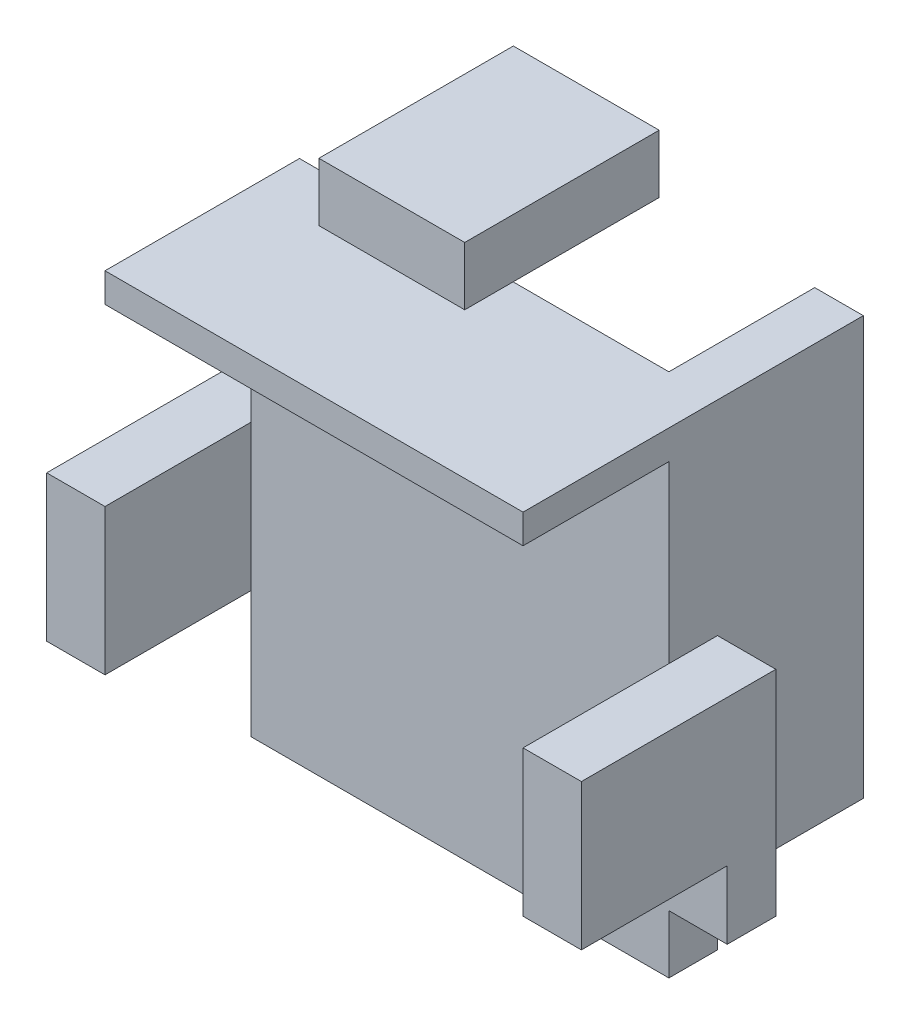
ISO-10303-21;
HEADER;
FILE_DESCRIPTION(('STEP AP214'),'2;1');
FILE_NAME('part.step','',(''),(''),'','','');
FILE_SCHEMA(('AUTOMOTIVE_DESIGN { 1 0 10303 214 1 1 1 1 }'));
ENDSEC;
DATA;
#1=APPLICATION_CONTEXT('core data for automotive mechanical design processes');
#2=APPLICATION_PROTOCOL_DEFINITION('international standard','automotive_design',2000,#1);
#3=PRODUCT_CONTEXT('',#1,'mechanical');
#4=PRODUCT('Part','Part','',(#3));
#5=PRODUCT_RELATED_PRODUCT_CATEGORY('part','',(#4));
#6=PRODUCT_DEFINITION_FORMATION('','',#4);
#7=PRODUCT_DEFINITION_CONTEXT('part definition',#1,'design');
#8=PRODUCT_DEFINITION('design','',#6,#7);
#9=PRODUCT_DEFINITION_SHAPE('','',#8);
#10=(LENGTH_UNIT() NAMED_UNIT(*) SI_UNIT(.MILLI.,.METRE.));
#11=(NAMED_UNIT(*) PLANE_ANGLE_UNIT() SI_UNIT($,.RADIAN.));
#12=(NAMED_UNIT(*) SI_UNIT($,.STERADIAN.) SOLID_ANGLE_UNIT());
#13=UNCERTAINTY_MEASURE_WITH_UNIT(LENGTH_MEASURE(1.E-05),#10,'distance_accuracy_value','');
#14=(GEOMETRIC_REPRESENTATION_CONTEXT(3) GLOBAL_UNCERTAINTY_ASSIGNED_CONTEXT((#13)) GLOBAL_UNIT_ASSIGNED_CONTEXT((#10,
#11,#12)) REPRESENTATION_CONTEXT('',''));
#15=CARTESIAN_POINT('',(0.,0.,0.));
#16=DIRECTION('',(0.,0.,1.));
#17=DIRECTION('',(1.,0.,0.));
#18=AXIS2_PLACEMENT_3D('',#15,#16,#17);
#19=CARTESIAN_POINT('',(-64.7969593030904,52.0531902447985,-20.));
#20=DIRECTION('',(-1.,0.,0.));
#21=DIRECTION('',(0.,0.,1.));
#22=AXIS2_PLACEMENT_3D('',#19,#20,#21);
#23=PLANE('',#22);
#24=DIRECTION('',(0.,-1.,0.));
#25=VECTOR('',#24,1.);
#26=CARTESIAN_POINT('',(-64.7969593030904,52.0531902447985,0.));
#27=LINE('',#26,#25);
#28=CARTESIAN_POINT('',(-64.7969593030904,58.0531902447985,0.));
#29=VERTEX_POINT('',#28);
#30=CARTESIAN_POINT('',(-64.7969593030904,52.0531902447985,0.));
#31=VERTEX_POINT('',#30);
#32=EDGE_CURVE('E110',#29,#31,#27,.T.);
#33=ORIENTED_EDGE('',*,*,#32,.F.);
#34=DIRECTION('',(0.,0.,1.));
#35=VECTOR('',#34,1.);
#36=CARTESIAN_POINT('',(-64.7969593030904,58.0531902447985,-20.));
#37=LINE('',#36,#35);
#38=CARTESIAN_POINT('',(-64.7969593030904,58.0531902447985,-20.));
#39=VERTEX_POINT('',#38);
#40=EDGE_CURVE('E12',#39,#29,#37,.T.);
#41=ORIENTED_EDGE('',*,*,#40,.F.);
#42=DIRECTION('',(0.,-1.,0.));
#43=VECTOR('',#42,1.);
#44=CARTESIAN_POINT('',(-64.7969593030904,52.0531902447985,-20.));
#45=LINE('',#44,#43);
#46=CARTESIAN_POINT('',(-64.7969593030904,52.0531902447985,-20.));
#47=VERTEX_POINT('',#46);
#48=EDGE_CURVE('E104',#39,#47,#45,.T.);
#49=ORIENTED_EDGE('',*,*,#48,.T.);
#50=DIRECTION('',(0.,0.,1.));
#51=VECTOR('',#50,1.);
#52=CARTESIAN_POINT('',(-64.7969593030904,52.0531902447985,-20.));
#53=LINE('',#52,#51);
#54=EDGE_CURVE('E49',#47,#31,#53,.T.);
#55=ORIENTED_EDGE('',*,*,#54,.T.);
#56=EDGE_LOOP('',(#33,#41,#49,#55));
#57=FACE_BOUND('',#56,.T.);
#58=ADVANCED_FACE('F46',(#57),#23,.T.);
#59=CARTESIAN_POINT('',(-64.7969593030904,58.0531902447985,-20.));
#60=DIRECTION('',(0.,1.,0.));
#61=DIRECTION('',(0.,0.,1.));
#62=AXIS2_PLACEMENT_3D('',#59,#60,#61);
#63=PLANE('',#62);
#64=DIRECTION('',(-1.,0.,0.));
#65=VECTOR('',#64,1.);
#66=CARTESIAN_POINT('',(-64.7969593030904,58.0531902447985,0.));
#67=LINE('',#66,#65);
#68=CARTESIAN_POINT('',(-49.7969593030904,58.0531902447985,0.));
#69=VERTEX_POINT('',#68);
#70=EDGE_CURVE('E106',#69,#29,#67,.T.);
#71=ORIENTED_EDGE('',*,*,#70,.F.);
#72=DIRECTION('',(0.,0.,1.));
#73=VECTOR('',#72,1.);
#74=CARTESIAN_POINT('',(-49.7969593030904,58.0531902447985,-20.));
#75=LINE('',#74,#73);
#76=CARTESIAN_POINT('',(-49.7969593030904,58.0531902447985,-20.));
#77=VERTEX_POINT('',#76);
#78=EDGE_CURVE('E55',#77,#69,#75,.T.);
#79=ORIENTED_EDGE('',*,*,#78,.F.);
#80=DIRECTION('',(-1.,0.,0.));
#81=VECTOR('',#80,1.);
#82=CARTESIAN_POINT('',(-64.7969593030904,58.0531902447985,-20.));
#83=LINE('',#82,#81);
#84=EDGE_CURVE('E101',#77,#39,#83,.T.);
#85=ORIENTED_EDGE('',*,*,#84,.T.);
#86=ORIENTED_EDGE('',*,*,#40,.T.);
#87=EDGE_LOOP('',(#71,#79,#85,#86));
#88=FACE_BOUND('',#87,.T.);
#89=ADVANCED_FACE('F120',(#88),#63,.T.);
#90=CARTESIAN_POINT('',(-49.7969593030904,52.0531902447985,-20.));
#91=DIRECTION('',(1.,0.,0.));
#92=DIRECTION('',(0.,0.,-1.));
#93=AXIS2_PLACEMENT_3D('',#90,#91,#92);
#94=PLANE('',#93);
#95=DIRECTION('',(0.,1.,0.));
#96=VECTOR('',#95,1.);
#97=CARTESIAN_POINT('',(-49.7969593030904,52.0531902447985,0.));
#98=LINE('',#97,#96);
#99=CARTESIAN_POINT('',(-49.7969593030904,52.0531902447985,0.));
#100=VERTEX_POINT('',#99);
#101=EDGE_CURVE('E96',#100,#69,#98,.T.);
#102=ORIENTED_EDGE('',*,*,#101,.F.);
#103=DIRECTION('',(0.,0.,1.));
#104=VECTOR('',#103,1.);
#105=CARTESIAN_POINT('',(-49.7969593030904,52.0531902447985,-20.));
#106=LINE('',#105,#104);
#107=CARTESIAN_POINT('',(-49.7969593030904,52.0531902447985,-20.));
#108=VERTEX_POINT('',#107);
#109=EDGE_CURVE('E91',#108,#100,#106,.T.);
#110=ORIENTED_EDGE('',*,*,#109,.F.);
#111=DIRECTION('',(0.,1.,0.));
#112=VECTOR('',#111,1.);
#113=CARTESIAN_POINT('',(-49.7969593030904,52.0531902447985,-20.));
#114=LINE('',#113,#112);
#115=EDGE_CURVE('E94',#108,#77,#114,.T.);
#116=ORIENTED_EDGE('',*,*,#115,.T.);
#117=ORIENTED_EDGE('',*,*,#78,.T.);
#118=EDGE_LOOP('',(#102,#110,#116,#117));
#119=FACE_BOUND('',#118,.T.);
#120=ADVANCED_FACE('F93',(#119),#94,.T.);
#121=CARTESIAN_POINT('',(-64.7969593030904,52.0531902447985,-20.));
#122=DIRECTION('',(0.,-1.,0.));
#123=DIRECTION('',(0.,0.,-1.));
#124=AXIS2_PLACEMENT_3D('',#121,#122,#123);
#125=PLANE('',#124);
#126=DIRECTION('',(1.,0.,0.));
#127=VECTOR('',#126,1.);
#128=CARTESIAN_POINT('',(-64.7969593030904,52.0531902447985,0.));
#129=LINE('',#128,#127);
#130=EDGE_CURVE('E113',#31,#100,#129,.T.);
#131=ORIENTED_EDGE('',*,*,#130,.F.);
#132=ORIENTED_EDGE('',*,*,#54,.F.);
#133=DIRECTION('',(1.,0.,0.));
#134=VECTOR('',#133,1.);
#135=CARTESIAN_POINT('',(-64.7969593030904,52.0531902447985,-20.));
#136=LINE('',#135,#134);
#137=EDGE_CURVE('E100',#47,#108,#136,.T.);
#138=ORIENTED_EDGE('',*,*,#137,.T.);
#139=ORIENTED_EDGE('',*,*,#109,.T.);
#140=EDGE_LOOP('',(#131,#132,#138,#139));
#141=FACE_BOUND('',#140,.T.);
#142=ADVANCED_FACE('F103',(#141),#125,.T.);
#143=CARTESIAN_POINT('',(0.,0.,-20.));
#144=DIRECTION('',(0.,0.,-1.));
#145=DIRECTION('',(-1.,0.,0.));
#146=AXIS2_PLACEMENT_3D('',#143,#144,#145);
#147=PLANE('',#146);
#148=ORIENTED_EDGE('',*,*,#48,.F.);
#149=ORIENTED_EDGE('',*,*,#84,.F.);
#150=ORIENTED_EDGE('',*,*,#115,.F.);
#151=ORIENTED_EDGE('',*,*,#137,.F.);
#152=EDGE_LOOP('',(#148,#149,#150,#151));
#153=FACE_BOUND('',#152,.T.);
#154=ADVANCED_FACE('F99',(#153),#147,.T.);
#155=CARTESIAN_POINT('',(0.,0.,0.));
#156=DIRECTION('',(0.,0.,-1.));
#157=DIRECTION('',(-1.,0.,0.));
#158=AXIS2_PLACEMENT_3D('',#155,#156,#157);
#159=PLANE('',#158);
#160=ORIENTED_EDGE('',*,*,#32,.T.);
#161=ORIENTED_EDGE('',*,*,#130,.T.);
#162=ORIENTED_EDGE('',*,*,#101,.T.);
#163=ORIENTED_EDGE('',*,*,#70,.T.);
#164=EDGE_LOOP('',(#160,#161,#162,#163));
#165=FACE_BOUND('',#164,.T.);
#166=ADVANCED_FACE('F119',(#165),#159,.F.);
#167=CLOSED_SHELL('',(#58,#89,#120,#142,#154,#166));
#168=MANIFOLD_SOLID_BREP('B2',#167);
#169=CARTESIAN_POINT('',(0.,0.,-5.));
#170=DIRECTION('',(0.,0.,1.));
#171=DIRECTION('',(1.,0.,0.));
#172=AXIS2_PLACEMENT_3D('',#169,#170,#171);
#173=PLANE('',#172);
#174=DIRECTION('',(0.,-1.,0.));
#175=VECTOR('',#174,1.);
#176=CARTESIAN_POINT('',(-28.7969593030904,52.032605761782,-5.));
#177=LINE('',#176,#175);
#178=CARTESIAN_POINT('',(-28.7969593030904,31.032605761782,-5.));
#179=VERTEX_POINT('',#178);
#180=CARTESIAN_POINT('',(-28.7969593030904,9.03260576178203,-5.));
#181=VERTEX_POINT('',#180);
#182=EDGE_CURVE('E352',#179,#181,#177,.T.);
#183=ORIENTED_EDGE('',*,*,#182,.F.);
#184=DIRECTION('',(1.,0.,0.));
#185=VECTOR('',#184,1.);
#186=CARTESIAN_POINT('',(0.,31.032605761782,-5.));
#187=LINE('',#186,#185);
#188=CARTESIAN_POINT('',(-22.7969593030904,31.032605761782,-5.));
#189=VERTEX_POINT('',#188);
#190=EDGE_CURVE('E443',#179,#189,#187,.T.);
#191=ORIENTED_EDGE('',*,*,#190,.T.);
#192=DIRECTION('',(0.,-1.,0.));
#193=VECTOR('',#192,1.);
#194=CARTESIAN_POINT('',(-22.7969593030904,0.,-5.));
#195=LINE('',#194,#193);
#196=CARTESIAN_POINT('',(-22.7969593030904,9.03260576178203,-5.));
#197=VERTEX_POINT('',#196);
#198=EDGE_CURVE('E446',#189,#197,#195,.T.);
#199=ORIENTED_EDGE('',*,*,#198,.T.);
#200=DIRECTION('',(1.,0.,0.));
#201=VECTOR('',#200,1.);
#202=CARTESIAN_POINT('',(0.,9.03260576178203,-5.));
#203=LINE('',#202,#201);
#204=EDGE_CURVE('E449',#181,#197,#203,.T.);
#205=ORIENTED_EDGE('',*,*,#204,.F.);
#206=EDGE_LOOP('',(#183,#191,#199,#205));
#207=FACE_BOUND('',#206,.T.);
#208=ADVANCED_FACE('F169',(#207),#173,.F.);
#209=DIRECTION('',(-1.,0.,0.));
#210=VECTOR('',#209,1.);
#211=CARTESIAN_POINT('',(-28.7969593030904,9.03260576178203,-5.));
#212=LINE('',#211,#210);
#213=CARTESIAN_POINT('',(-33.7969593030904,9.03260576178203,-5.));
#214=VERTEX_POINT('',#213);
#215=EDGE_CURVE('E562',#181,#214,#212,.T.);
#216=ORIENTED_EDGE('',*,*,#215,.F.);
#217=DIRECTION('',(0.,-1.,0.));
#218=VECTOR('',#217,1.);
#219=CARTESIAN_POINT('',(-28.7969593030904,0.,-5.));
#220=LINE('',#219,#218);
#221=CARTESIAN_POINT('',(-28.7969593030904,3.03260576178203,-5.));
#222=VERTEX_POINT('',#221);
#223=EDGE_CURVE('E448',#181,#222,#220,.T.);
#224=ORIENTED_EDGE('',*,*,#223,.T.);
#225=DIRECTION('',(1.,0.,0.));
#226=VECTOR('',#225,1.);
#227=CARTESIAN_POINT('',(0.,3.03260576178202,-5.));
#228=LINE('',#227,#226);
#229=CARTESIAN_POINT('',(-35.9278686997028,3.03260576178203,-5.));
#230=VERTEX_POINT('',#229);
#231=EDGE_CURVE('E455',#230,#222,#228,.T.);
#232=ORIENTED_EDGE('',*,*,#231,.F.);
#233=DIRECTION('',(0.,-1.,0.));
#234=VECTOR('',#233,1.);
#235=CARTESIAN_POINT('',(-35.9278686997028,9.03260576178203,-5.));
#236=LINE('',#235,#234);
#237=CARTESIAN_POINT('',(-35.9278686997028,9.03260576178203,-5.));
#238=VERTEX_POINT('',#237);
#239=EDGE_CURVE('E510',#238,#230,#236,.T.);
#240=ORIENTED_EDGE('',*,*,#239,.F.);
#241=DIRECTION('',(1.,0.,0.));
#242=VECTOR('',#241,1.);
#243=CARTESIAN_POINT('',(-50.7969593030904,9.03260576178203,-5.));
#244=LINE('',#243,#242);
#245=CARTESIAN_POINT('',(-64.7969593030904,9.03260576178203,-5.));
#246=VERTEX_POINT('',#245);
#247=EDGE_CURVE('E500',#246,#238,#244,.T.);
#248=ORIENTED_EDGE('',*,*,#247,.F.);
#249=DIRECTION('',(0.,-1.,0.));
#250=VECTOR('',#249,1.);
#251=CARTESIAN_POINT('',(-64.7969593030904,9.03260576178203,-5.));
#252=LINE('',#251,#250);
#253=CARTESIAN_POINT('',(-64.7969593030904,3.03260576178203,-5.));
#254=VERTEX_POINT('',#253);
#255=EDGE_CURVE('E372',#246,#254,#252,.T.);
#256=ORIENTED_EDGE('',*,*,#255,.T.);
#257=DIRECTION('',(1.,0.,0.));
#258=VECTOR('',#257,1.);
#259=CARTESIAN_POINT('',(-71.7969593030904,3.03260576178203,-5.));
#260=LINE('',#259,#258);
#261=CARTESIAN_POINT('',(-71.7969593030904,3.03260576178203,-5.));
#262=VERTEX_POINT('',#261);
#263=EDGE_CURVE('E369',#262,#254,#260,.T.);
#264=ORIENTED_EDGE('',*,*,#263,.F.);
#265=DIRECTION('',(0.,-1.,0.));
#266=VECTOR('',#265,1.);
#267=CARTESIAN_POINT('',(-71.7969593030904,9.03260576178203,-5.));
#268=LINE('',#267,#266);
#269=CARTESIAN_POINT('',(-71.7969593030904,16.032605761782,-5.));
#270=VERTEX_POINT('',#269);
#271=EDGE_CURVE('E365',#270,#262,#268,.T.);
#272=ORIENTED_EDGE('',*,*,#271,.F.);
#273=DIRECTION('',(1.,0.,0.));
#274=VECTOR('',#273,1.);
#275=CARTESIAN_POINT('',(0.,16.032605761782,-5.));
#276=LINE('',#275,#274);
#277=CARTESIAN_POINT('',(-77.7969593030904,16.032605761782,-5.));
#278=VERTEX_POINT('',#277);
#279=EDGE_CURVE('E458',#278,#270,#276,.T.);
#280=ORIENTED_EDGE('',*,*,#279,.F.);
#281=DIRECTION('',(0.,-1.,0.));
#282=VECTOR('',#281,1.);
#283=CARTESIAN_POINT('',(-77.7969593030904,0.,-5.));
#284=LINE('',#283,#282);
#285=CARTESIAN_POINT('',(-77.7969593030904,31.032605761782,-5.));
#286=VERTEX_POINT('',#285);
#287=EDGE_CURVE('E463',#286,#278,#284,.T.);
#288=ORIENTED_EDGE('',*,*,#287,.F.);
#289=DIRECTION('',(1.,0.,0.));
#290=VECTOR('',#289,1.);
#291=CARTESIAN_POINT('',(0.,31.032605761782,-5.));
#292=LINE('',#291,#290);
#293=CARTESIAN_POINT('',(-71.7969593030904,31.032605761782,-5.));
#294=VERTEX_POINT('',#293);
#295=EDGE_CURVE('E385',#286,#294,#292,.T.);
#296=ORIENTED_EDGE('',*,*,#295,.T.);
#297=DIRECTION('',(0.,1.,0.));
#298=VECTOR('',#297,1.);
#299=CARTESIAN_POINT('',(-71.7969593030904,0.,-5.));
#300=LINE('',#299,#298);
#301=CARTESIAN_POINT('',(-71.7969593030904,52.032605761782,-5.));
#302=VERTEX_POINT('',#301);
#303=EDGE_CURVE('E454',#294,#302,#300,.T.);
#304=ORIENTED_EDGE('',*,*,#303,.T.);
#305=DIRECTION('',(-1.,0.,0.));
#306=VECTOR('',#305,1.);
#307=CARTESIAN_POINT('',(0.,52.032605761782,-5.));
#308=LINE('',#307,#306);
#309=CARTESIAN_POINT('',(-33.7969593030904,52.032605761782,-5.));
#310=VERTEX_POINT('',#309);
#311=EDGE_CURVE('E191',#310,#302,#308,.T.);
#312=ORIENTED_EDGE('',*,*,#311,.F.);
#313=DIRECTION('',(0.,1.,0.));
#314=VECTOR('',#313,1.);
#315=CARTESIAN_POINT('',(-33.7969593030904,52.032605761782,-5.));
#316=LINE('',#315,#314);
#317=EDGE_CURVE('E186',#214,#310,#316,.T.);
#318=ORIENTED_EDGE('',*,*,#317,.F.);
#319=EDGE_LOOP('',(#216,#224,#232,#240,#248,#256,#264,#272,#280,#288,#296,#304,#312,#318));
#320=FACE_BOUND('',#319,.T.);
#321=ADVANCED_FACE('F535',(#320),#173,.F.);
#322=CARTESIAN_POINT('',(-71.7969593030904,0.,-5.));
#323=DIRECTION('',(1.,0.,0.));
#324=DIRECTION('',(0.,0.,-1.));
#325=AXIS2_PLACEMENT_3D('',#322,#323,#324);
#326=PLANE('',#325);
#327=ORIENTED_EDGE('',*,*,#303,.F.);
#328=DIRECTION('',(0.,0.,1.));
#329=VECTOR('',#328,1.);
#330=CARTESIAN_POINT('',(-71.7969593030904,31.032605761782,-5.));
#331=LINE('',#330,#329);
#332=CARTESIAN_POINT('',(-71.7969593030904,31.032605761782,0.));
#333=VERTEX_POINT('',#332);
#334=EDGE_CURVE('E437',#294,#333,#331,.T.);
#335=ORIENTED_EDGE('',*,*,#334,.T.);
#336=DIRECTION('',(0.,1.,0.));
#337=VECTOR('',#336,1.);
#338=CARTESIAN_POINT('',(-71.7969593030904,0.,0.));
#339=LINE('',#338,#337);
#340=CARTESIAN_POINT('',(-71.7969593030904,49.032605761782,0.));
#341=VERTEX_POINT('',#340);
#342=EDGE_CURVE('E439',#333,#341,#339,.T.);
#343=ORIENTED_EDGE('',*,*,#342,.T.);
#344=DIRECTION('',(0.,0.,-1.));
#345=VECTOR('',#344,1.);
#346=CARTESIAN_POINT('',(-71.7969593030904,49.032605761782,15.));
#347=LINE('',#346,#345);
#348=CARTESIAN_POINT('',(-71.7969593030904,49.032605761782,15.));
#349=VERTEX_POINT('',#348);
#350=EDGE_CURVE('E490',#349,#341,#347,.T.);
#351=ORIENTED_EDGE('',*,*,#350,.F.);
#352=DIRECTION('',(0.,1.,0.));
#353=VECTOR('',#352,1.);
#354=CARTESIAN_POINT('',(-71.7969593030904,0.,15.));
#355=LINE('',#354,#353);
#356=CARTESIAN_POINT('',(-71.7969593030904,52.032605761782,15.));
#357=VERTEX_POINT('',#356);
#358=EDGE_CURVE('E442',#349,#357,#355,.T.);
#359=ORIENTED_EDGE('',*,*,#358,.T.);
#360=DIRECTION('',(0.,0.,1.));
#361=VECTOR('',#360,1.);
#362=CARTESIAN_POINT('',(-71.7969593030904,52.032605761782,-5.));
#363=LINE('',#362,#361);
#364=EDGE_CURVE('E417',#302,#357,#363,.T.);
#365=ORIENTED_EDGE('',*,*,#364,.F.);
#366=EDGE_LOOP('',(#327,#335,#343,#351,#359,#365));
#367=FACE_BOUND('',#366,.T.);
#368=ADVANCED_FACE('F587',(#367),#326,.F.);
#369=CARTESIAN_POINT('',(0.,52.032605761782,-5.));
#370=DIRECTION('',(0.,1.,0.));
#371=DIRECTION('',(0.,0.,1.));
#372=AXIS2_PLACEMENT_3D('',#369,#370,#371);
#373=PLANE('',#372);
#374=DIRECTION('',(0.,0.,-1.));
#375=VECTOR('',#374,1.);
#376=CARTESIAN_POINT('',(-28.7969593030904,52.032605761782,15.));
#377=LINE('',#376,#375);
#378=CARTESIAN_POINT('',(-28.7969593030904,52.032605761782,15.));
#379=VERTEX_POINT('',#378);
#380=CARTESIAN_POINT('',(-28.7969593030904,52.032605761782,-20.));
#381=VERTEX_POINT('',#380);
#382=EDGE_CURVE('E378',#379,#381,#377,.T.);
#383=ORIENTED_EDGE('',*,*,#382,.T.);
#384=DIRECTION('',(1.,0.,0.));
#385=VECTOR('',#384,1.);
#386=CARTESIAN_POINT('',(-28.7969593030904,52.032605761782,-20.));
#387=LINE('',#386,#385);
#388=CARTESIAN_POINT('',(-33.7969593030904,52.032605761782,-20.));
#389=VERTEX_POINT('',#388);
#390=EDGE_CURVE('E345',#389,#381,#387,.T.);
#391=ORIENTED_EDGE('',*,*,#390,.F.);
#392=DIRECTION('',(0.,0.,1.));
#393=VECTOR('',#392,1.);
#394=CARTESIAN_POINT('',(-33.7969593030904,52.032605761782,-20.));
#395=LINE('',#394,#393);
#396=EDGE_CURVE('E358',#389,#310,#395,.T.);
#397=ORIENTED_EDGE('',*,*,#396,.T.);
#398=ORIENTED_EDGE('',*,*,#311,.T.);
#399=ORIENTED_EDGE('',*,*,#364,.T.);
#400=DIRECTION('',(-1.,0.,0.));
#401=VECTOR('',#400,1.);
#402=CARTESIAN_POINT('',(0.,52.032605761782,15.));
#403=LINE('',#402,#401);
#404=EDGE_CURVE('E493',#379,#357,#403,.T.);
#405=ORIENTED_EDGE('',*,*,#404,.F.);
#406=EDGE_LOOP('',(#383,#391,#397,#398,#399,#405));
#407=FACE_BOUND('',#406,.T.);
#408=ADVANCED_FACE('F573',(#407),#373,.T.);
#409=CARTESIAN_POINT('',(-28.7969593030904,16.032605761782,15.));
#410=DIRECTION('',(0.,1.,0.));
#411=DIRECTION('',(0.,0.,1.));
#412=AXIS2_PLACEMENT_3D('',#409,#410,#411);
#413=PLANE('',#412);
#414=DIRECTION('',(1.,0.,0.));
#415=VECTOR('',#414,1.);
#416=CARTESIAN_POINT('',(-28.7969593030904,16.032605761782,0.));
#417=LINE('',#416,#415);
#418=CARTESIAN_POINT('',(-28.7969593030904,16.032605761782,0.));
#419=VERTEX_POINT('',#418);
#420=CARTESIAN_POINT('',(-22.7969593030904,16.032605761782,0.));
#421=VERTEX_POINT('',#420);
#422=EDGE_CURVE('E381',#419,#421,#417,.T.);
#423=ORIENTED_EDGE('',*,*,#422,.T.);
#424=DIRECTION('',(0.,0.,-1.));
#425=VECTOR('',#424,1.);
#426=CARTESIAN_POINT('',(-22.7969593030904,16.032605761782,15.));
#427=LINE('',#426,#425);
#428=CARTESIAN_POINT('',(-22.7969593030904,16.032605761782,15.));
#429=VERTEX_POINT('',#428);
#430=EDGE_CURVE('E388',#429,#421,#427,.T.);
#431=ORIENTED_EDGE('',*,*,#430,.F.);
#432=DIRECTION('',(1.,0.,0.));
#433=VECTOR('',#432,1.);
#434=CARTESIAN_POINT('',(-28.7969593030904,16.032605761782,15.));
#435=LINE('',#434,#433);
#436=CARTESIAN_POINT('',(-28.7969593030904,16.032605761782,15.));
#437=VERTEX_POINT('',#436);
#438=EDGE_CURVE('E398',#437,#429,#435,.T.);
#439=ORIENTED_EDGE('',*,*,#438,.F.);
#440=DIRECTION('',(0.,0.,-1.));
#441=VECTOR('',#440,1.);
#442=CARTESIAN_POINT('',(-28.7969593030904,16.032605761782,15.));
#443=LINE('',#442,#441);
#444=EDGE_CURVE('E384',#437,#419,#443,.T.);
#445=ORIENTED_EDGE('',*,*,#444,.T.);
#446=EDGE_LOOP('',(#423,#431,#439,#445));
#447=FACE_BOUND('',#446,.T.);
#448=ADVANCED_FACE('F656',(#447),#413,.F.);
#449=CARTESIAN_POINT('',(-22.7969593030904,31.032605761782,15.));
#450=DIRECTION('',(1.,0.,0.));
#451=DIRECTION('',(0.,0.,-1.));
#452=AXIS2_PLACEMENT_3D('',#449,#450,#451);
#453=PLANE('',#452);
#454=ORIENTED_EDGE('',*,*,#430,.T.);
#455=DIRECTION('',(0.,-1.,0.));
#456=VECTOR('',#455,1.);
#457=CARTESIAN_POINT('',(-22.7969593030904,0.,0.));
#458=LINE('',#457,#456);
#459=CARTESIAN_POINT('',(-22.7969593030904,9.03260576178203,0.));
#460=VERTEX_POINT('',#459);
#461=EDGE_CURVE('E390',#421,#460,#458,.T.);
#462=ORIENTED_EDGE('',*,*,#461,.T.);
#463=DIRECTION('',(0.,0.,1.));
#464=VECTOR('',#463,1.);
#465=CARTESIAN_POINT('',(-22.7969593030904,9.03260576178203,-5.));
#466=LINE('',#465,#464);
#467=EDGE_CURVE('E431',#197,#460,#466,.T.);
#468=ORIENTED_EDGE('',*,*,#467,.F.);
#469=ORIENTED_EDGE('',*,*,#198,.F.);
#470=DIRECTION('',(0.,0.,-1.));
#471=VECTOR('',#470,1.);
#472=CARTESIAN_POINT('',(-22.7969593030904,31.032605761782,15.));
#473=LINE('',#472,#471);
#474=CARTESIAN_POINT('',(-22.7969593030904,31.032605761782,15.));
#475=VERTEX_POINT('',#474);
#476=EDGE_CURVE('E391',#475,#189,#473,.T.);
#477=ORIENTED_EDGE('',*,*,#476,.F.);
#478=DIRECTION('',(0.,-1.,0.));
#479=VECTOR('',#478,1.);
#480=CARTESIAN_POINT('',(-22.7969593030904,31.032605761782,15.));
#481=LINE('',#480,#479);
#482=EDGE_CURVE('E394',#475,#429,#481,.T.);
#483=ORIENTED_EDGE('',*,*,#482,.T.);
#484=EDGE_LOOP('',(#454,#462,#468,#469,#477,#483));
#485=FACE_BOUND('',#484,.T.);
#486=ADVANCED_FACE('F659',(#485),#453,.T.);
#487=CARTESIAN_POINT('',(-28.7969593030904,31.032605761782,15.));
#488=DIRECTION('',(0.,1.,0.));
#489=DIRECTION('',(0.,0.,1.));
#490=AXIS2_PLACEMENT_3D('',#487,#488,#489);
#491=PLANE('',#490);
#492=ORIENTED_EDGE('',*,*,#476,.T.);
#493=ORIENTED_EDGE('',*,*,#190,.F.);
#494=DIRECTION('',(0.,0.,1.));
#495=VECTOR('',#494,1.);
#496=CARTESIAN_POINT('',(-28.7969593030904,31.032605761782,-5.));
#497=LINE('',#496,#495);
#498=CARTESIAN_POINT('',(-28.7969593030904,31.032605761782,0.));
#499=VERTEX_POINT('',#498);
#500=EDGE_CURVE('E393',#179,#499,#497,.T.);
#501=ORIENTED_EDGE('',*,*,#500,.T.);
#502=DIRECTION('',(0.,0.,-1.));
#503=VECTOR('',#502,1.);
#504=CARTESIAN_POINT('',(-28.7969593030904,31.032605761782,15.));
#505=LINE('',#504,#503);
#506=CARTESIAN_POINT('',(-28.7969593030904,31.032605761782,15.));
#507=VERTEX_POINT('',#506);
#508=EDGE_CURVE('E395',#507,#499,#505,.T.);
#509=ORIENTED_EDGE('',*,*,#508,.F.);
#510=DIRECTION('',(1.,0.,0.));
#511=VECTOR('',#510,1.);
#512=CARTESIAN_POINT('',(-28.7969593030904,31.032605761782,15.));
#513=LINE('',#512,#511);
#514=EDGE_CURVE('E408',#507,#475,#513,.T.);
#515=ORIENTED_EDGE('',*,*,#514,.T.);
#516=EDGE_LOOP('',(#492,#493,#501,#509,#515));
#517=FACE_BOUND('',#516,.T.);
#518=ADVANCED_FACE('F559',(#517),#491,.T.);
#519=CARTESIAN_POINT('',(-28.7969593030904,16.032605761782,15.));
#520=DIRECTION('',(-1.,0.,0.));
#521=DIRECTION('',(0.,0.,1.));
#522=AXIS2_PLACEMENT_3D('',#519,#520,#521);
#523=PLANE('',#522);
#524=DIRECTION('',(0.,1.,0.));
#525=VECTOR('',#524,1.);
#526=CARTESIAN_POINT('',(-28.7969593030904,16.032605761782,0.));
#527=LINE('',#526,#525);
#528=EDGE_CURVE('E401',#419,#499,#527,.T.);
#529=ORIENTED_EDGE('',*,*,#528,.F.);
#530=ORIENTED_EDGE('',*,*,#444,.F.);
#531=DIRECTION('',(0.,1.,0.));
#532=VECTOR('',#531,1.);
#533=CARTESIAN_POINT('',(-28.7969593030904,16.032605761782,15.));
#534=LINE('',#533,#532);
#535=EDGE_CURVE('E399',#437,#507,#534,.T.);
#536=ORIENTED_EDGE('',*,*,#535,.T.);
#537=ORIENTED_EDGE('',*,*,#508,.T.);
#538=EDGE_LOOP('',(#529,#530,#536,#537));
#539=FACE_BOUND('',#538,.T.);
#540=ADVANCED_FACE('F665',(#539),#523,.T.);
#541=CARTESIAN_POINT('',(0.,0.,15.));
#542=DIRECTION('',(0.,0.,-1.));
#543=DIRECTION('',(-1.,0.,0.));
#544=AXIS2_PLACEMENT_3D('',#541,#542,#543);
#545=PLANE('',#544);
#546=ORIENTED_EDGE('',*,*,#438,.T.);
#547=ORIENTED_EDGE('',*,*,#482,.F.);
#548=ORIENTED_EDGE('',*,*,#514,.F.);
#549=ORIENTED_EDGE('',*,*,#535,.F.);
#550=EDGE_LOOP('',(#546,#547,#548,#549));
#551=FACE_BOUND('',#550,.T.);
#552=ADVANCED_FACE('F668',(#551),#545,.F.);
#553=CARTESIAN_POINT('',(0.,0.,0.));
#554=DIRECTION('',(0.,0.,1.));
#555=DIRECTION('',(1.,0.,0.));
#556=AXIS2_PLACEMENT_3D('',#553,#554,#555);
#557=PLANE('',#556);
#558=DIRECTION('',(1.,0.,0.));
#559=VECTOR('',#558,1.);
#560=CARTESIAN_POINT('',(0.,3.03260576178202,0.));
#561=LINE('',#560,#559);
#562=CARTESIAN_POINT('',(-71.7969593030904,3.03260576178203,0.));
#563=VERTEX_POINT('',#562);
#564=CARTESIAN_POINT('',(-28.7969593030904,3.03260576178203,0.));
#565=VERTEX_POINT('',#564);
#566=EDGE_CURVE('E426',#563,#565,#561,.T.);
#567=ORIENTED_EDGE('',*,*,#566,.T.);
#568=DIRECTION('',(0.,-1.,0.));
#569=VECTOR('',#568,1.);
#570=CARTESIAN_POINT('',(-28.7969593030904,0.,0.));
#571=LINE('',#570,#569);
#572=CARTESIAN_POINT('',(-28.7969593030904,9.03260576178203,0.));
#573=VERTEX_POINT('',#572);
#574=EDGE_CURVE('E427',#573,#565,#571,.T.);
#575=ORIENTED_EDGE('',*,*,#574,.F.);
#576=DIRECTION('',(1.,0.,0.));
#577=VECTOR('',#576,1.);
#578=CARTESIAN_POINT('',(0.,9.03260576178203,0.));
#579=LINE('',#578,#577);
#580=EDGE_CURVE('E405',#573,#460,#579,.T.);
#581=ORIENTED_EDGE('',*,*,#580,.T.);
#582=ORIENTED_EDGE('',*,*,#461,.F.);
#583=ORIENTED_EDGE('',*,*,#422,.F.);
#584=ORIENTED_EDGE('',*,*,#528,.T.);
#585=DIRECTION('',(0.,-1.,0.));
#586=VECTOR('',#585,1.);
#587=CARTESIAN_POINT('',(-28.7969593030904,0.,0.));
#588=LINE('',#587,#586);
#589=CARTESIAN_POINT('',(-28.7969593030904,49.032605761782,0.));
#590=VERTEX_POINT('',#589);
#591=EDGE_CURVE('E422',#590,#499,#588,.T.);
#592=ORIENTED_EDGE('',*,*,#591,.F.);
#593=DIRECTION('',(-1.,0.,0.));
#594=VECTOR('',#593,1.);
#595=CARTESIAN_POINT('',(0.,49.032605761782,0.));
#596=LINE('',#595,#594);
#597=EDGE_CURVE('E414',#590,#341,#596,.T.);
#598=ORIENTED_EDGE('',*,*,#597,.T.);
#599=ORIENTED_EDGE('',*,*,#342,.F.);
#600=DIRECTION('',(0.,-1.,0.));
#601=VECTOR('',#600,1.);
#602=CARTESIAN_POINT('',(-71.7969593030904,0.,0.));
#603=LINE('',#602,#601);
#604=CARTESIAN_POINT('',(-71.7969593030904,16.032605761782,0.));
#605=VERTEX_POINT('',#604);
#606=EDGE_CURVE('E433',#333,#605,#603,.T.);
#607=ORIENTED_EDGE('',*,*,#606,.T.);
#608=DIRECTION('',(0.,1.,0.));
#609=VECTOR('',#608,1.);
#610=CARTESIAN_POINT('',(-71.7969593030904,0.,0.));
#611=LINE('',#610,#609);
#612=EDGE_CURVE('E434',#563,#605,#611,.T.);
#613=ORIENTED_EDGE('',*,*,#612,.F.);
#614=EDGE_LOOP('',(#567,#575,#581,#582,#583,#584,#592,#598,#599,#607,#613));
#615=FACE_BOUND('',#614,.T.);
#616=ADVANCED_FACE('F546',(#615),#557,.T.);
#617=CARTESIAN_POINT('',(-28.7969593030904,0.,-5.));
#618=DIRECTION('',(-1.,0.,0.));
#619=DIRECTION('',(0.,-1.,0.));
#620=AXIS2_PLACEMENT_3D('',#617,#618,#619);
#621=PLANE('',#620);
#622=ORIENTED_EDGE('',*,*,#500,.F.);
#623=ORIENTED_EDGE('',*,*,#182,.T.);
#624=DIRECTION('',(0.,0.,1.));
#625=VECTOR('',#624,1.);
#626=CARTESIAN_POINT('',(-28.7969593030904,9.03260576178203,-20.));
#627=LINE('',#626,#625);
#628=CARTESIAN_POINT('',(-28.7969593030904,9.03260576178203,-20.));
#629=VERTEX_POINT('',#628);
#630=EDGE_CURVE('E333',#629,#181,#627,.T.);
#631=ORIENTED_EDGE('',*,*,#630,.F.);
#632=DIRECTION('',(0.,-1.,0.));
#633=VECTOR('',#632,1.);
#634=CARTESIAN_POINT('',(-28.7969593030904,52.032605761782,-20.));
#635=LINE('',#634,#633);
#636=EDGE_CURVE('E339',#381,#629,#635,.T.);
#637=ORIENTED_EDGE('',*,*,#636,.F.);
#638=ORIENTED_EDGE('',*,*,#382,.F.);
#639=DIRECTION('',(0.,-1.,0.));
#640=VECTOR('',#639,1.);
#641=CARTESIAN_POINT('',(-28.7969593030904,0.,15.));
#642=LINE('',#641,#640);
#643=CARTESIAN_POINT('',(-28.7969593030904,49.032605761782,15.));
#644=VERTEX_POINT('',#643);
#645=EDGE_CURVE('E404',#379,#644,#642,.T.);
#646=ORIENTED_EDGE('',*,*,#645,.T.);
#647=DIRECTION('',(0.,0.,-1.));
#648=VECTOR('',#647,1.);
#649=CARTESIAN_POINT('',(-28.7969593030904,49.032605761782,15.));
#650=LINE('',#649,#648);
#651=EDGE_CURVE('E494',#644,#590,#650,.T.);
#652=ORIENTED_EDGE('',*,*,#651,.T.);
#653=ORIENTED_EDGE('',*,*,#591,.T.);
#654=EDGE_LOOP('',(#622,#623,#631,#637,#638,#646,#652,#653));
#655=FACE_BOUND('',#654,.T.);
#656=ADVANCED_FACE('F350',(#655),#621,.F.);
#657=CARTESIAN_POINT('',(0.,9.03260576178203,-5.));
#658=DIRECTION('',(0.,-1.,0.));
#659=DIRECTION('',(0.,0.,-1.));
#660=AXIS2_PLACEMENT_3D('',#657,#658,#659);
#661=PLANE('',#660);
#662=ORIENTED_EDGE('',*,*,#580,.F.);
#663=DIRECTION('',(0.,0.,1.));
#664=VECTOR('',#663,1.);
#665=CARTESIAN_POINT('',(-28.7969593030904,9.03260576178203,-5.));
#666=LINE('',#665,#664);
#667=EDGE_CURVE('E430',#181,#573,#666,.T.);
#668=ORIENTED_EDGE('',*,*,#667,.F.);
#669=ORIENTED_EDGE('',*,*,#204,.T.);
#670=ORIENTED_EDGE('',*,*,#467,.T.);
#671=EDGE_LOOP('',(#662,#668,#669,#670));
#672=FACE_BOUND('',#671,.T.);
#673=ADVANCED_FACE('F550',(#672),#661,.T.);
#674=CARTESIAN_POINT('',(-28.7969593030904,0.,-5.));
#675=DIRECTION('',(-1.,0.,0.));
#676=DIRECTION('',(0.,-1.,0.));
#677=AXIS2_PLACEMENT_3D('',#674,#675,#676);
#678=PLANE('',#677);
#679=ORIENTED_EDGE('',*,*,#574,.T.);
#680=DIRECTION('',(0.,0.,1.));
#681=VECTOR('',#680,1.);
#682=CARTESIAN_POINT('',(-28.7969593030904,3.03260576178203,-5.));
#683=LINE('',#682,#681);
#684=EDGE_CURVE('E438',#222,#565,#683,.T.);
#685=ORIENTED_EDGE('',*,*,#684,.F.);
#686=ORIENTED_EDGE('',*,*,#223,.F.);
#687=ORIENTED_EDGE('',*,*,#667,.T.);
#688=EDGE_LOOP('',(#679,#685,#686,#687));
#689=FACE_BOUND('',#688,.T.);
#690=ADVANCED_FACE('F542',(#689),#678,.F.);
#691=CARTESIAN_POINT('',(0.,3.03260576178202,-5.));
#692=DIRECTION('',(0.,-1.,0.));
#693=DIRECTION('',(1.,0.,0.));
#694=AXIS2_PLACEMENT_3D('',#691,#692,#693);
#695=PLANE('',#694);
#696=ORIENTED_EDGE('',*,*,#684,.T.);
#697=ORIENTED_EDGE('',*,*,#566,.F.);
#698=DIRECTION('',(0.,0.,1.));
#699=VECTOR('',#698,1.);
#700=CARTESIAN_POINT('',(-71.7969593030904,3.03260576178203,-5.));
#701=LINE('',#700,#699);
#702=EDGE_CURVE('E375',#262,#563,#701,.T.);
#703=ORIENTED_EDGE('',*,*,#702,.F.);
#704=ORIENTED_EDGE('',*,*,#263,.T.);
#705=DIRECTION('',(0.,0.,1.));
#706=VECTOR('',#705,1.);
#707=CARTESIAN_POINT('',(-64.7969593030904,3.03260576178203,-20.));
#708=LINE('',#707,#706);
#709=CARTESIAN_POINT('',(-64.7969593030904,3.03260576178203,-20.));
#710=VERTEX_POINT('',#709);
#711=EDGE_CURVE('E356',#710,#254,#708,.T.);
#712=ORIENTED_EDGE('',*,*,#711,.F.);
#713=DIRECTION('',(-1.,0.,0.));
#714=VECTOR('',#713,1.);
#715=CARTESIAN_POINT('',(-50.7969593030904,3.03260576178203,-20.));
#716=LINE('',#715,#714);
#717=CARTESIAN_POINT('',(-35.9278686997028,3.03260576178203,-20.));
#718=VERTEX_POINT('',#717);
#719=EDGE_CURVE('E44',#718,#710,#716,.T.);
#720=ORIENTED_EDGE('',*,*,#719,.F.);
#721=DIRECTION('',(0.,0.,1.));
#722=VECTOR('',#721,1.);
#723=CARTESIAN_POINT('',(-35.9278686997028,3.03260576178203,-20.));
#724=LINE('',#723,#722);
#725=EDGE_CURVE('E457',#718,#230,#724,.T.);
#726=ORIENTED_EDGE('',*,*,#725,.T.);
#727=ORIENTED_EDGE('',*,*,#231,.T.);
#728=EDGE_LOOP('',(#696,#697,#703,#704,#712,#720,#726,#727));
#729=FACE_BOUND('',#728,.T.);
#730=ADVANCED_FACE('F530',(#729),#695,.T.);
#731=DIRECTION('',(0.,0.,1.));
#732=VECTOR('',#731,1.);
#733=CARTESIAN_POINT('',(-71.7969593030904,16.032605761782,-5.));
#734=LINE('',#733,#732);
#735=EDGE_CURVE('E462',#270,#605,#734,.T.);
#736=ORIENTED_EDGE('',*,*,#735,.F.);
#737=ORIENTED_EDGE('',*,*,#271,.T.);
#738=ORIENTED_EDGE('',*,*,#702,.T.);
#739=ORIENTED_EDGE('',*,*,#612,.T.);
#740=EDGE_LOOP('',(#736,#737,#738,#739));
#741=FACE_BOUND('',#740,.T.);
#742=ADVANCED_FACE('F603',(#741),#326,.F.);
#743=CARTESIAN_POINT('',(0.,16.032605761782,-5.));
#744=DIRECTION('',(0.,-1.,0.));
#745=DIRECTION('',(0.,0.,-1.));
#746=AXIS2_PLACEMENT_3D('',#743,#744,#745);
#747=PLANE('',#746);
#748=ORIENTED_EDGE('',*,*,#735,.T.);
#749=DIRECTION('',(0.,0.,-1.));
#750=VECTOR('',#749,1.);
#751=CARTESIAN_POINT('',(-71.7969593030904,16.032605761782,15.));
#752=LINE('',#751,#750);
#753=CARTESIAN_POINT('',(-71.7969593030904,16.032605761782,15.));
#754=VERTEX_POINT('',#753);
#755=EDGE_CURVE('E475',#754,#605,#752,.T.);
#756=ORIENTED_EDGE('',*,*,#755,.F.);
#757=DIRECTION('',(1.,0.,0.));
#758=VECTOR('',#757,1.);
#759=CARTESIAN_POINT('',(0.,16.032605761782,15.));
#760=LINE('',#759,#758);
#761=CARTESIAN_POINT('',(-77.7969593030904,16.032605761782,15.));
#762=VERTEX_POINT('',#761);
#763=EDGE_CURVE('E481',#762,#754,#760,.T.);
#764=ORIENTED_EDGE('',*,*,#763,.F.);
#765=DIRECTION('',(0.,0.,1.));
#766=VECTOR('',#765,1.);
#767=CARTESIAN_POINT('',(-77.7969593030904,16.032605761782,-5.));
#768=LINE('',#767,#766);
#769=EDGE_CURVE('E461',#278,#762,#768,.T.);
#770=ORIENTED_EDGE('',*,*,#769,.F.);
#771=ORIENTED_EDGE('',*,*,#279,.T.);
#772=EDGE_LOOP('',(#748,#756,#764,#770,#771));
#773=FACE_BOUND('',#772,.T.);
#774=ADVANCED_FACE('F599',(#773),#747,.T.);
#775=CARTESIAN_POINT('',(-77.7969593030904,0.,-5.));
#776=DIRECTION('',(-1.,0.,0.));
#777=DIRECTION('',(0.,0.,1.));
#778=AXIS2_PLACEMENT_3D('',#775,#776,#777);
#779=PLANE('',#778);
#780=ORIENTED_EDGE('',*,*,#769,.T.);
#781=DIRECTION('',(0.,-1.,0.));
#782=VECTOR('',#781,1.);
#783=CARTESIAN_POINT('',(-77.7969593030904,0.,15.));
#784=LINE('',#783,#782);
#785=CARTESIAN_POINT('',(-77.7969593030904,31.032605761782,15.));
#786=VERTEX_POINT('',#785);
#787=EDGE_CURVE('E477',#786,#762,#784,.T.);
#788=ORIENTED_EDGE('',*,*,#787,.F.);
#789=DIRECTION('',(0.,0.,1.));
#790=VECTOR('',#789,1.);
#791=CARTESIAN_POINT('',(-77.7969593030904,31.032605761782,-5.));
#792=LINE('',#791,#790);
#793=EDGE_CURVE('E466',#286,#786,#792,.T.);
#794=ORIENTED_EDGE('',*,*,#793,.F.);
#795=ORIENTED_EDGE('',*,*,#287,.T.);
#796=EDGE_LOOP('',(#780,#788,#794,#795));
#797=FACE_BOUND('',#796,.T.);
#798=ADVANCED_FACE('F614',(#797),#779,.T.);
#799=CARTESIAN_POINT('',(0.,31.032605761782,-5.));
#800=DIRECTION('',(0.,-1.,0.));
#801=DIRECTION('',(0.,0.,-1.));
#802=AXIS2_PLACEMENT_3D('',#799,#800,#801);
#803=PLANE('',#802);
#804=ORIENTED_EDGE('',*,*,#793,.T.);
#805=DIRECTION('',(1.,0.,0.));
#806=VECTOR('',#805,1.);
#807=CARTESIAN_POINT('',(0.,31.032605761782,15.));
#808=LINE('',#807,#806);
#809=CARTESIAN_POINT('',(-71.7969593030904,31.032605761782,15.));
#810=VERTEX_POINT('',#809);
#811=EDGE_CURVE('E474',#786,#810,#808,.T.);
#812=ORIENTED_EDGE('',*,*,#811,.T.);
#813=DIRECTION('',(0.,0.,-1.));
#814=VECTOR('',#813,1.);
#815=CARTESIAN_POINT('',(-71.7969593030904,31.032605761782,15.));
#816=LINE('',#815,#814);
#817=EDGE_CURVE('E471',#810,#333,#816,.T.);
#818=ORIENTED_EDGE('',*,*,#817,.T.);
#819=ORIENTED_EDGE('',*,*,#334,.F.);
#820=ORIENTED_EDGE('',*,*,#295,.F.);
#821=EDGE_LOOP('',(#804,#812,#818,#819,#820));
#822=FACE_BOUND('',#821,.T.);
#823=ADVANCED_FACE('F607',(#822),#803,.F.);
#824=CARTESIAN_POINT('',(-71.7969593030904,0.,15.));
#825=DIRECTION('',(1.,0.,0.));
#826=DIRECTION('',(0.,0.,-1.));
#827=AXIS2_PLACEMENT_3D('',#824,#825,#826);
#828=PLANE('',#827);
#829=ORIENTED_EDGE('',*,*,#606,.F.);
#830=ORIENTED_EDGE('',*,*,#817,.F.);
#831=DIRECTION('',(0.,-1.,0.));
#832=VECTOR('',#831,1.);
#833=CARTESIAN_POINT('',(-71.7969593030904,0.,15.));
#834=LINE('',#833,#832);
#835=EDGE_CURVE('E478',#810,#754,#834,.T.);
#836=ORIENTED_EDGE('',*,*,#835,.T.);
#837=ORIENTED_EDGE('',*,*,#755,.T.);
#838=EDGE_LOOP('',(#829,#830,#836,#837));
#839=FACE_BOUND('',#838,.T.);
#840=ADVANCED_FACE('F605',(#839),#828,.T.);
#841=CARTESIAN_POINT('',(0.,0.,15.));
#842=DIRECTION('',(0.,0.,1.));
#843=DIRECTION('',(1.,0.,0.));
#844=AXIS2_PLACEMENT_3D('',#841,#842,#843);
#845=PLANE('',#844);
#846=ORIENTED_EDGE('',*,*,#835,.F.);
#847=ORIENTED_EDGE('',*,*,#811,.F.);
#848=ORIENTED_EDGE('',*,*,#787,.T.);
#849=ORIENTED_EDGE('',*,*,#763,.T.);
#850=EDGE_LOOP('',(#846,#847,#848,#849));
#851=FACE_BOUND('',#850,.T.);
#852=ADVANCED_FACE('F611',(#851),#845,.T.);
#853=CARTESIAN_POINT('',(0.,49.032605761782,15.));
#854=DIRECTION('',(0.,-1.,0.));
#855=DIRECTION('',(0.,0.,-1.));
#856=AXIS2_PLACEMENT_3D('',#853,#854,#855);
#857=PLANE('',#856);
#858=ORIENTED_EDGE('',*,*,#597,.F.);
#859=ORIENTED_EDGE('',*,*,#651,.F.);
#860=DIRECTION('',(-1.,0.,0.));
#861=VECTOR('',#860,1.);
#862=CARTESIAN_POINT('',(0.,49.032605761782,15.));
#863=LINE('',#862,#861);
#864=EDGE_CURVE('E483',#644,#349,#863,.T.);
#865=ORIENTED_EDGE('',*,*,#864,.T.);
#866=ORIENTED_EDGE('',*,*,#350,.T.);
#867=EDGE_LOOP('',(#858,#859,#865,#866));
#868=FACE_BOUND('',#867,.T.);
#869=ADVANCED_FACE('F583',(#868),#857,.T.);
#870=CARTESIAN_POINT('',(0.,0.,15.));
#871=DIRECTION('',(0.,0.,1.));
#872=DIRECTION('',(1.,0.,0.));
#873=AXIS2_PLACEMENT_3D('',#870,#871,#872);
#874=PLANE('',#873);
#875=ORIENTED_EDGE('',*,*,#358,.F.);
#876=ORIENTED_EDGE('',*,*,#864,.F.);
#877=ORIENTED_EDGE('',*,*,#645,.F.);
#878=ORIENTED_EDGE('',*,*,#404,.T.);
#879=EDGE_LOOP('',(#875,#876,#877,#878));
#880=FACE_BOUND('',#879,.T.);
#881=ADVANCED_FACE('F581',(#880),#874,.T.);
#882=CARTESIAN_POINT('',(-50.7969593030904,9.03260576178203,-20.));
#883=DIRECTION('',(0.,-1.,0.));
#884=DIRECTION('',(0.,0.,-1.));
#885=AXIS2_PLACEMENT_3D('',#882,#883,#884);
#886=PLANE('',#885);
#887=DIRECTION('',(0.,0.,1.));
#888=VECTOR('',#887,1.);
#889=CARTESIAN_POINT('',(-35.9278686997028,9.03260576178203,-20.));
#890=LINE('',#889,#888);
#891=CARTESIAN_POINT('',(-35.9278686997028,9.03260576178203,-20.));
#892=VERTEX_POINT('',#891);
#893=EDGE_CURVE('E507',#892,#238,#890,.T.);
#894=ORIENTED_EDGE('',*,*,#893,.F.);
#895=DIRECTION('',(1.,0.,0.));
#896=VECTOR('',#895,1.);
#897=CARTESIAN_POINT('',(-50.7969593030904,9.03260576178203,-20.));
#898=LINE('',#897,#896);
#899=CARTESIAN_POINT('',(-64.7969593030904,9.03260576178203,-20.));
#900=VERTEX_POINT('',#899);
#901=EDGE_CURVE('E173',#900,#892,#898,.T.);
#902=ORIENTED_EDGE('',*,*,#901,.F.);
#903=DIRECTION('',(0.,0.,1.));
#904=VECTOR('',#903,1.);
#905=CARTESIAN_POINT('',(-64.7969593030904,9.03260576178203,-20.));
#906=LINE('',#905,#904);
#907=EDGE_CURVE('E362',#900,#246,#906,.T.);
#908=ORIENTED_EDGE('',*,*,#907,.T.);
#909=ORIENTED_EDGE('',*,*,#247,.T.);
#910=EDGE_LOOP('',(#894,#902,#908,#909));
#911=FACE_BOUND('',#910,.T.);
#912=ADVANCED_FACE('F521',(#911),#886,.F.);
#913=CARTESIAN_POINT('',(-35.9278686997028,9.03260576178203,-20.));
#914=DIRECTION('',(-1.,0.,0.));
#915=DIRECTION('',(0.,0.,1.));
#916=AXIS2_PLACEMENT_3D('',#913,#914,#915);
#917=PLANE('',#916);
#918=ORIENTED_EDGE('',*,*,#239,.T.);
#919=ORIENTED_EDGE('',*,*,#725,.F.);
#920=DIRECTION('',(0.,-1.,0.));
#921=VECTOR('',#920,1.);
#922=CARTESIAN_POINT('',(-35.9278686997028,9.03260576178203,-20.));
#923=LINE('',#922,#921);
#924=EDGE_CURVE('E178',#892,#718,#923,.T.);
#925=ORIENTED_EDGE('',*,*,#924,.F.);
#926=ORIENTED_EDGE('',*,*,#893,.T.);
#927=EDGE_LOOP('',(#918,#919,#925,#926));
#928=FACE_BOUND('',#927,.T.);
#929=ADVANCED_FACE('F524',(#928),#917,.F.);
#930=CARTESIAN_POINT('',(0.,0.,-20.));
#931=DIRECTION('',(0.,0.,1.));
#932=DIRECTION('',(1.,0.,0.));
#933=AXIS2_PLACEMENT_3D('',#930,#931,#932);
#934=PLANE('',#933);
#935=ORIENTED_EDGE('',*,*,#719,.T.);
#936=DIRECTION('',(0.,-1.,0.));
#937=VECTOR('',#936,1.);
#938=CARTESIAN_POINT('',(-64.7969593030904,3.03260576178203,-20.));
#939=LINE('',#938,#937);
#940=EDGE_CURVE('E353',#900,#710,#939,.T.);
#941=ORIENTED_EDGE('',*,*,#940,.F.);
#942=ORIENTED_EDGE('',*,*,#901,.T.);
#943=ORIENTED_EDGE('',*,*,#924,.T.);
#944=EDGE_LOOP('',(#935,#941,#942,#943));
#945=FACE_BOUND('',#944,.T.);
#946=ADVANCED_FACE('F171',(#945),#934,.F.);
#947=CARTESIAN_POINT('',(-64.7969593030904,3.03260576178203,-20.));
#948=DIRECTION('',(-1.,0.,0.));
#949=DIRECTION('',(0.,0.,1.));
#950=AXIS2_PLACEMENT_3D('',#947,#948,#949);
#951=PLANE('',#950);
#952=ORIENTED_EDGE('',*,*,#255,.F.);
#953=ORIENTED_EDGE('',*,*,#907,.F.);
#954=ORIENTED_EDGE('',*,*,#940,.T.);
#955=ORIENTED_EDGE('',*,*,#711,.T.);
#956=EDGE_LOOP('',(#952,#953,#954,#955));
#957=FACE_BOUND('',#956,.T.);
#958=ADVANCED_FACE('F534',(#957),#951,.T.);
#959=CARTESIAN_POINT('',(-28.7969593030904,9.03260576178203,-20.));
#960=DIRECTION('',(0.,1.,0.));
#961=DIRECTION('',(0.,0.,1.));
#962=AXIS2_PLACEMENT_3D('',#959,#960,#961);
#963=PLANE('',#962);
#964=ORIENTED_EDGE('',*,*,#215,.T.);
#965=DIRECTION('',(0.,0.,1.));
#966=VECTOR('',#965,1.);
#967=CARTESIAN_POINT('',(-33.7969593030904,9.03260576178203,-20.));
#968=LINE('',#967,#966);
#969=CARTESIAN_POINT('',(-33.7969593030904,9.03260576178203,-20.));
#970=VERTEX_POINT('',#969);
#971=EDGE_CURVE('E335',#970,#214,#968,.T.);
#972=ORIENTED_EDGE('',*,*,#971,.F.);
#973=DIRECTION('',(-1.,0.,0.));
#974=VECTOR('',#973,1.);
#975=CARTESIAN_POINT('',(-28.7969593030904,9.03260576178203,-20.));
#976=LINE('',#975,#974);
#977=EDGE_CURVE('E329',#629,#970,#976,.T.);
#978=ORIENTED_EDGE('',*,*,#977,.F.);
#979=ORIENTED_EDGE('',*,*,#630,.T.);
#980=EDGE_LOOP('',(#964,#972,#978,#979));
#981=FACE_BOUND('',#980,.T.);
#982=ADVANCED_FACE('F331',(#981),#963,.F.);
#983=CARTESIAN_POINT('',(-33.7969593030904,52.032605761782,-20.));
#984=DIRECTION('',(1.,0.,0.));
#985=DIRECTION('',(0.,1.,0.));
#986=AXIS2_PLACEMENT_3D('',#983,#984,#985);
#987=PLANE('',#986);
#988=ORIENTED_EDGE('',*,*,#317,.T.);
#989=ORIENTED_EDGE('',*,*,#396,.F.);
#990=DIRECTION('',(0.,1.,0.));
#991=VECTOR('',#990,1.);
#992=CARTESIAN_POINT('',(-33.7969593030904,52.032605761782,-20.));
#993=LINE('',#992,#991);
#994=EDGE_CURVE('E338',#970,#389,#993,.T.);
#995=ORIENTED_EDGE('',*,*,#994,.F.);
#996=ORIENTED_EDGE('',*,*,#971,.T.);
#997=EDGE_LOOP('',(#988,#989,#995,#996));
#998=FACE_BOUND('',#997,.T.);
#999=ADVANCED_FACE('F572',(#998),#987,.F.);
#1000=CARTESIAN_POINT('',(0.,0.,-20.));
#1001=DIRECTION('',(0.,0.,-1.));
#1002=DIRECTION('',(-1.,0.,0.));
#1003=AXIS2_PLACEMENT_3D('',#1000,#1001,#1002);
#1004=PLANE('',#1003);
#1005=ORIENTED_EDGE('',*,*,#636,.T.);
#1006=ORIENTED_EDGE('',*,*,#977,.T.);
#1007=ORIENTED_EDGE('',*,*,#994,.T.);
#1008=ORIENTED_EDGE('',*,*,#390,.T.);
#1009=EDGE_LOOP('',(#1005,#1006,#1007,#1008));
#1010=FACE_BOUND('',#1009,.T.);
#1011=ADVANCED_FACE('F343',(#1010),#1004,.T.);
#1012=CLOSED_SHELL('',(#208,#321,#368,#408,#448,#486,#518,#540,#552,#616,#656,#673,#690,#730,
#742,#774,#798,#823,#840,#852,#869,#881,#912,#929,#946,#958,#982,#999,#1011));
#1013=MANIFOLD_SOLID_BREP('B6',#1012);
#1014=ADVANCED_BREP_SHAPE_REPRESENTATION('',(#18,#168,#1013),#14);
#1015=SHAPE_DEFINITION_REPRESENTATION(#9,#1014);
ENDSEC;
END-ISO-10303-21;
